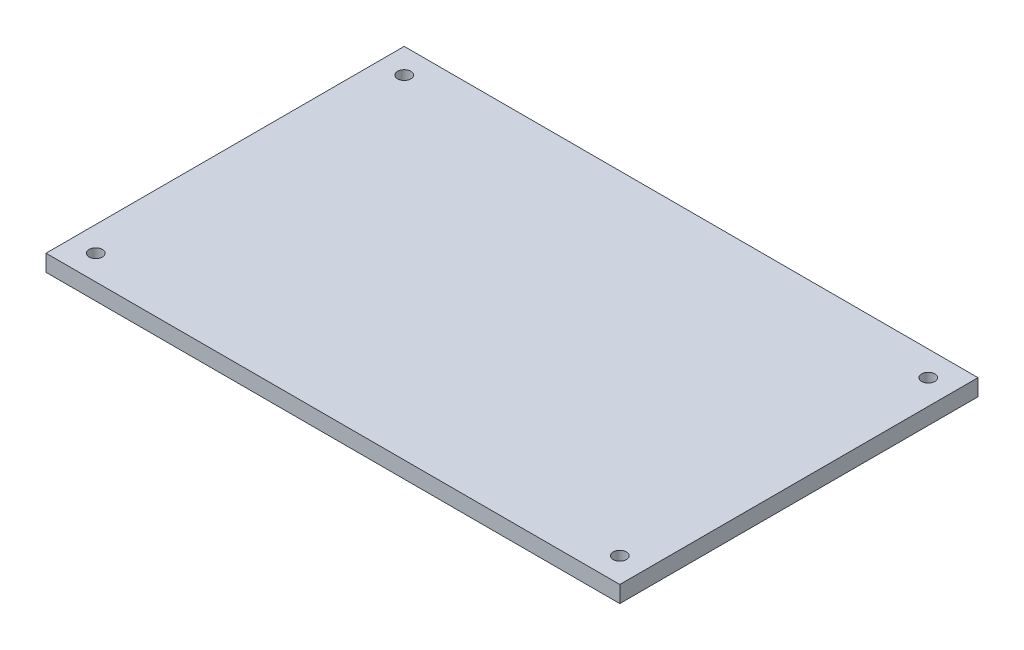
ISO-10303-21;
HEADER;
FILE_DESCRIPTION(('STEP AP214'),'2;1');
FILE_NAME('part.step','',(''),(''),'','','');
FILE_SCHEMA(('AUTOMOTIVE_DESIGN { 1 0 10303 214 1 1 1 1 }'));
ENDSEC;
DATA;
#1=APPLICATION_CONTEXT('core data for automotive mechanical design processes');
#2=APPLICATION_PROTOCOL_DEFINITION('international standard','automotive_design',2000,#1);
#3=PRODUCT_CONTEXT('',#1,'mechanical');
#4=PRODUCT('Part','Part','',(#3));
#5=PRODUCT_RELATED_PRODUCT_CATEGORY('part','',(#4));
#6=PRODUCT_DEFINITION_FORMATION('','',#4);
#7=PRODUCT_DEFINITION_CONTEXT('part definition',#1,'design');
#8=PRODUCT_DEFINITION('design','',#6,#7);
#9=PRODUCT_DEFINITION_SHAPE('','',#8);
#10=(LENGTH_UNIT() NAMED_UNIT(*) SI_UNIT(.MILLI.,.METRE.));
#11=(NAMED_UNIT(*) PLANE_ANGLE_UNIT() SI_UNIT($,.RADIAN.));
#12=(NAMED_UNIT(*) SI_UNIT($,.STERADIAN.) SOLID_ANGLE_UNIT());
#13=UNCERTAINTY_MEASURE_WITH_UNIT(LENGTH_MEASURE(1.E-05),#10,'distance_accuracy_value','');
#14=(GEOMETRIC_REPRESENTATION_CONTEXT(3) GLOBAL_UNCERTAINTY_ASSIGNED_CONTEXT((#13)) GLOBAL_UNIT_ASSIGNED_CONTEXT((#10,
#11,#12)) REPRESENTATION_CONTEXT('',''));
#15=CARTESIAN_POINT('',(0.,0.,0.));
#16=DIRECTION('',(0.,0.,1.));
#17=DIRECTION('',(1.,0.,0.));
#18=AXIS2_PLACEMENT_3D('',#15,#16,#17);
#19=CARTESIAN_POINT('',(0.,0.,0.));
#20=DIRECTION('',(0.,-1.,0.));
#21=DIRECTION('',(0.,0.,-1.));
#22=AXIS2_PLACEMENT_3D('',#19,#20,#21);
#23=PLANE('',#22);
#24=CARTESIAN_POINT('',(79.,0.,46.5));
#25=DIRECTION('',(0.,1.,0.));
#26=DIRECTION('',(0.,0.,1.));
#27=AXIS2_PLACEMENT_3D('',#24,#25,#26);
#28=CIRCLE('',#27,2.);
#29=CARTESIAN_POINT('',(79.,0.,48.5));
#30=VERTEX_POINT('',#29);
#31=EDGE_CURVE('E311',#30,#30,#28,.T.);
#32=ORIENTED_EDGE('',*,*,#31,.T.);
#33=EDGE_LOOP('',(#32));
#34=FACE_BOUND('',#33,.T.);
#35=CARTESIAN_POINT('',(-79.,0.,-46.5));
#36=DIRECTION('',(0.,1.,0.));
#37=DIRECTION('',(0.,0.,1.));
#38=AXIS2_PLACEMENT_3D('',#35,#36,#37);
#39=CIRCLE('',#38,2.);
#40=CARTESIAN_POINT('',(-79.,0.,-44.5));
#41=VERTEX_POINT('',#40);
#42=EDGE_CURVE('E327',#41,#41,#39,.T.);
#43=ORIENTED_EDGE('',*,*,#42,.T.);
#44=EDGE_LOOP('',(#43));
#45=FACE_BOUND('',#44,.T.);
#46=CARTESIAN_POINT('',(79.,0.,-46.5));
#47=DIRECTION('',(0.,1.,0.));
#48=DIRECTION('',(0.,0.,-1.));
#49=AXIS2_PLACEMENT_3D('',#46,#47,#48);
#50=CIRCLE('',#49,2.);
#51=CARTESIAN_POINT('',(79.,0.,-48.5));
#52=VERTEX_POINT('',#51);
#53=EDGE_CURVE('E319',#52,#52,#50,.T.);
#54=ORIENTED_EDGE('',*,*,#53,.T.);
#55=EDGE_LOOP('',(#54));
#56=FACE_BOUND('',#55,.T.);
#57=CARTESIAN_POINT('',(-79.,0.,46.5));
#58=DIRECTION('',(0.,1.,0.));
#59=DIRECTION('',(0.,0.,-1.));
#60=AXIS2_PLACEMENT_3D('',#57,#58,#59);
#61=CIRCLE('',#60,2.);
#62=CARTESIAN_POINT('',(-79.,0.,44.5));
#63=VERTEX_POINT('',#62);
#64=EDGE_CURVE('E292',#63,#63,#61,.T.);
#65=ORIENTED_EDGE('',*,*,#64,.T.);
#66=EDGE_LOOP('',(#65));
#67=FACE_BOUND('',#66,.T.);
#68=DIRECTION('',(-1.,0.,0.));
#69=VECTOR('',#68,1.);
#70=CARTESIAN_POINT('',(43.5,0.,-17.5));
#71=LINE('',#70,#69);
#72=CARTESIAN_POINT('',(43.5,0.,-17.5));
#73=VERTEX_POINT('',#72);
#74=CARTESIAN_POINT('',(21.5,0.,-17.5));
#75=VERTEX_POINT('',#74);
#76=EDGE_CURVE('E232',#73,#75,#71,.T.);
#77=ORIENTED_EDGE('',*,*,#76,.F.);
#78=DIRECTION('',(0.,0.,-1.));
#79=VECTOR('',#78,1.);
#80=CARTESIAN_POINT('',(43.5,0.,-54.));
#81=LINE('',#80,#79);
#82=CARTESIAN_POINT('',(43.5,0.,-54.));
#83=VERTEX_POINT('',#82);
#84=EDGE_CURVE('E61',#73,#83,#81,.T.);
#85=ORIENTED_EDGE('',*,*,#84,.T.);
#86=DIRECTION('',(-1.,0.,0.));
#87=VECTOR('',#86,1.);
#88=CARTESIAN_POINT('',(-86.5,0.,-54.));
#89=LINE('',#88,#87);
#90=CARTESIAN_POINT('',(86.5,0.,-54.));
#91=VERTEX_POINT('',#90);
#92=EDGE_CURVE('E358',#91,#83,#89,.T.);
#93=ORIENTED_EDGE('',*,*,#92,.F.);
#94=DIRECTION('',(0.,0.,-1.));
#95=VECTOR('',#94,1.);
#96=CARTESIAN_POINT('',(86.5,0.,54.));
#97=LINE('',#96,#95);
#98=CARTESIAN_POINT('',(86.5,0.,54.));
#99=VERTEX_POINT('',#98);
#100=EDGE_CURVE('E335',#99,#91,#97,.T.);
#101=ORIENTED_EDGE('',*,*,#100,.F.);
#102=DIRECTION('',(1.,0.,0.));
#103=VECTOR('',#102,1.);
#104=CARTESIAN_POINT('',(-86.5,0.,54.));
#105=LINE('',#104,#103);
#106=CARTESIAN_POINT('',(-86.5,0.,54.));
#107=VERTEX_POINT('',#106);
#108=EDGE_CURVE('E344',#107,#99,#105,.T.);
#109=ORIENTED_EDGE('',*,*,#108,.F.);
#110=DIRECTION('',(0.,0.,1.));
#111=VECTOR('',#110,1.);
#112=CARTESIAN_POINT('',(-86.5,0.,54.));
#113=LINE('',#112,#111);
#114=CARTESIAN_POINT('',(-86.5,0.,-54.));
#115=VERTEX_POINT('',#114);
#116=EDGE_CURVE('E362',#115,#107,#113,.T.);
#117=ORIENTED_EDGE('',*,*,#116,.F.);
#118=CARTESIAN_POINT('',(-43.5,0.,-54.));
#119=VERTEX_POINT('',#118);
#120=EDGE_CURVE('E357',#119,#115,#89,.T.);
#121=ORIENTED_EDGE('',*,*,#120,.F.);
#122=DIRECTION('',(0.,0.,-1.));
#123=VECTOR('',#122,1.);
#124=CARTESIAN_POINT('',(-43.5,0.,-24.));
#125=LINE('',#124,#123);
#126=CARTESIAN_POINT('',(-43.5,0.,-17.5));
#127=VERTEX_POINT('',#126);
#128=EDGE_CURVE('E438',#119,#127,#125,.F.);
#129=ORIENTED_EDGE('',*,*,#128,.T.);
#130=DIRECTION('',(-1.,0.,0.));
#131=VECTOR('',#130,1.);
#132=CARTESIAN_POINT('',(-21.5,0.,-17.5));
#133=LINE('',#132,#131);
#134=CARTESIAN_POINT('',(-21.5,0.,-17.5));
#135=VERTEX_POINT('',#134);
#136=EDGE_CURVE('E249',#135,#127,#133,.T.);
#137=ORIENTED_EDGE('',*,*,#136,.F.);
#138=DIRECTION('',(0.,0.,-1.));
#139=VECTOR('',#138,1.);
#140=CARTESIAN_POINT('',(-21.5,0.,-54.));
#141=LINE('',#140,#139);
#142=CARTESIAN_POINT('',(-21.5,0.,-54.));
#143=VERTEX_POINT('',#142);
#144=EDGE_CURVE('E434',#135,#143,#141,.T.);
#145=ORIENTED_EDGE('',*,*,#144,.T.);
#146=CARTESIAN_POINT('',(21.5,0.,-54.));
#147=VERTEX_POINT('',#146);
#148=EDGE_CURVE('E363',#147,#143,#89,.T.);
#149=ORIENTED_EDGE('',*,*,#148,.F.);
#150=DIRECTION('',(0.,0.,-1.));
#151=VECTOR('',#150,1.);
#152=CARTESIAN_POINT('',(21.5,0.,-24.));
#153=LINE('',#152,#151);
#154=EDGE_CURVE('E68',#147,#75,#153,.F.);
#155=ORIENTED_EDGE('',*,*,#154,.T.);
#156=EDGE_LOOP('',(#77,#85,#93,#101,#109,#117,#121,#129,#137,#145,#149,#155));
#157=FACE_BOUND('',#156,.T.);
#158=ADVANCED_FACE('F45',(#34,#45,#56,#67,#157),#23,.T.);
#159=CARTESIAN_POINT('',(0.,5.,0.));
#160=DIRECTION('',(0.,-1.,0.));
#161=DIRECTION('',(0.,0.,-1.));
#162=AXIS2_PLACEMENT_3D('',#159,#160,#161);
#163=PLANE('',#162);
#164=DIRECTION('',(0.,0.,-1.));
#165=VECTOR('',#164,1.);
#166=CARTESIAN_POINT('',(86.5,5.,54.));
#167=LINE('',#166,#165);
#168=CARTESIAN_POINT('',(86.5,5.,54.));
#169=VERTEX_POINT('',#168);
#170=CARTESIAN_POINT('',(86.5,5.,-54.));
#171=VERTEX_POINT('',#170);
#172=EDGE_CURVE('E339',#169,#171,#167,.T.);
#173=ORIENTED_EDGE('',*,*,#172,.T.);
#174=DIRECTION('',(-1.,0.,0.));
#175=VECTOR('',#174,1.);
#176=CARTESIAN_POINT('',(-86.5,5.,-54.));
#177=LINE('',#176,#175);
#178=CARTESIAN_POINT('',(-86.5,5.,-54.));
#179=VERTEX_POINT('',#178);
#180=EDGE_CURVE('E343',#171,#179,#177,.T.);
#181=ORIENTED_EDGE('',*,*,#180,.T.);
#182=DIRECTION('',(0.,0.,1.));
#183=VECTOR('',#182,1.);
#184=CARTESIAN_POINT('',(-86.5,5.,54.));
#185=LINE('',#184,#183);
#186=CARTESIAN_POINT('',(-86.5,5.,54.));
#187=VERTEX_POINT('',#186);
#188=EDGE_CURVE('E347',#179,#187,#185,.T.);
#189=ORIENTED_EDGE('',*,*,#188,.T.);
#190=DIRECTION('',(1.,0.,0.));
#191=VECTOR('',#190,1.);
#192=CARTESIAN_POINT('',(-86.5,5.,54.));
#193=LINE('',#192,#191);
#194=EDGE_CURVE('E350',#187,#169,#193,.T.);
#195=ORIENTED_EDGE('',*,*,#194,.T.);
#196=EDGE_LOOP('',(#173,#181,#189,#195));
#197=FACE_BOUND('',#196,.T.);
#198=CARTESIAN_POINT('',(-79.,5.,-46.5));
#199=DIRECTION('',(0.,1.,0.));
#200=DIRECTION('',(0.,0.,1.));
#201=AXIS2_PLACEMENT_3D('',#198,#199,#200);
#202=CIRCLE('',#201,2.);
#203=CARTESIAN_POINT('',(-79.,5.,-44.5));
#204=VERTEX_POINT('',#203);
#205=EDGE_CURVE('E331',#204,#204,#202,.T.);
#206=ORIENTED_EDGE('',*,*,#205,.F.);
#207=EDGE_LOOP('',(#206));
#208=FACE_BOUND('',#207,.T.);
#209=CARTESIAN_POINT('',(79.,5.,-46.5));
#210=DIRECTION('',(0.,1.,0.));
#211=DIRECTION('',(0.,0.,-1.));
#212=AXIS2_PLACEMENT_3D('',#209,#210,#211);
#213=CIRCLE('',#212,2.);
#214=CARTESIAN_POINT('',(79.,5.,-48.5));
#215=VERTEX_POINT('',#214);
#216=EDGE_CURVE('E323',#215,#215,#213,.T.);
#217=ORIENTED_EDGE('',*,*,#216,.F.);
#218=EDGE_LOOP('',(#217));
#219=FACE_BOUND('',#218,.T.);
#220=CARTESIAN_POINT('',(79.,5.,46.5));
#221=DIRECTION('',(0.,1.,0.));
#222=DIRECTION('',(0.,0.,1.));
#223=AXIS2_PLACEMENT_3D('',#220,#221,#222);
#224=CIRCLE('',#223,2.);
#225=CARTESIAN_POINT('',(79.,5.,48.5));
#226=VERTEX_POINT('',#225);
#227=EDGE_CURVE('E315',#226,#226,#224,.T.);
#228=ORIENTED_EDGE('',*,*,#227,.F.);
#229=EDGE_LOOP('',(#228));
#230=FACE_BOUND('',#229,.T.);
#231=CARTESIAN_POINT('',(-79.,5.,46.5));
#232=DIRECTION('',(0.,1.,0.));
#233=DIRECTION('',(0.,0.,-1.));
#234=AXIS2_PLACEMENT_3D('',#231,#232,#233);
#235=CIRCLE('',#234,2.);
#236=CARTESIAN_POINT('',(-79.,5.,44.5));
#237=VERTEX_POINT('',#236);
#238=EDGE_CURVE('E307',#237,#237,#235,.T.);
#239=ORIENTED_EDGE('',*,*,#238,.F.);
#240=EDGE_LOOP('',(#239));
#241=FACE_BOUND('',#240,.T.);
#242=ADVANCED_FACE('F486',(#197,#208,#219,#230,#241),#163,.F.);
#243=CARTESIAN_POINT('',(86.5,5.,54.));
#244=DIRECTION('',(-1.,0.,0.));
#245=DIRECTION('',(0.,0.,1.));
#246=AXIS2_PLACEMENT_3D('',#243,#244,#245);
#247=PLANE('',#246);
#248=ORIENTED_EDGE('',*,*,#100,.T.);
#249=DIRECTION('',(0.,-1.,0.));
#250=VECTOR('',#249,1.);
#251=CARTESIAN_POINT('',(86.5,5.,-54.));
#252=LINE('',#251,#250);
#253=EDGE_CURVE('E379',#171,#91,#252,.T.);
#254=ORIENTED_EDGE('',*,*,#253,.F.);
#255=ORIENTED_EDGE('',*,*,#172,.F.);
#256=DIRECTION('',(0.,-1.,0.));
#257=VECTOR('',#256,1.);
#258=CARTESIAN_POINT('',(86.5,5.,54.));
#259=LINE('',#258,#257);
#260=EDGE_CURVE('E353',#169,#99,#259,.T.);
#261=ORIENTED_EDGE('',*,*,#260,.T.);
#262=EDGE_LOOP('',(#248,#254,#255,#261));
#263=FACE_BOUND('',#262,.T.);
#264=ADVANCED_FACE('F483',(#263),#247,.F.);
#265=CARTESIAN_POINT('',(-86.5,5.,-54.));
#266=DIRECTION('',(0.,0.,1.));
#267=DIRECTION('',(1.,0.,0.));
#268=AXIS2_PLACEMENT_3D('',#265,#266,#267);
#269=PLANE('',#268);
#270=DIRECTION('',(0.,-1.,0.));
#271=VECTOR('',#270,1.);
#272=CARTESIAN_POINT('',(42.5,0.,-54.));
#273=LINE('',#272,#271);
#274=CARTESIAN_POINT('',(42.5,-1.,-54.));
#275=VERTEX_POINT('',#274);
#276=CARTESIAN_POINT('',(42.5,-9.2,-54.));
#277=VERTEX_POINT('',#276);
#278=EDGE_CURVE('E280',#275,#277,#273,.T.);
#279=ORIENTED_EDGE('',*,*,#278,.T.);
#280=CARTESIAN_POINT('',(41.5,-9.2,-54.));
#281=DIRECTION('',(0.,0.,1.));
#282=DIRECTION('',(1.,0.,0.));
#283=AXIS2_PLACEMENT_3D('',#280,#281,#282);
#284=CIRCLE('',#283,1.);
#285=CARTESIAN_POINT('',(41.5,-10.2,-54.));
#286=VERTEX_POINT('',#285);
#287=EDGE_CURVE('E196',#277,#286,#284,.F.);
#288=ORIENTED_EDGE('',*,*,#287,.T.);
#289=DIRECTION('',(-1.,0.,0.));
#290=VECTOR('',#289,1.);
#291=CARTESIAN_POINT('',(42.5,-10.2,-54.));
#292=LINE('',#291,#290);
#293=CARTESIAN_POINT('',(23.5,-10.2,-54.));
#294=VERTEX_POINT('',#293);
#295=EDGE_CURVE('E285',#286,#294,#292,.T.);
#296=ORIENTED_EDGE('',*,*,#295,.T.);
#297=CARTESIAN_POINT('',(23.5,-9.2,-54.));
#298=DIRECTION('',(0.,0.,1.));
#299=DIRECTION('',(1.,0.,0.));
#300=AXIS2_PLACEMENT_3D('',#297,#298,#299);
#301=CIRCLE('',#300,1.);
#302=CARTESIAN_POINT('',(22.5,-9.2,-54.));
#303=VERTEX_POINT('',#302);
#304=EDGE_CURVE('E190',#294,#303,#301,.F.);
#305=ORIENTED_EDGE('',*,*,#304,.T.);
#306=DIRECTION('',(0.,1.,0.));
#307=VECTOR('',#306,1.);
#308=CARTESIAN_POINT('',(22.5,0.,-54.));
#309=LINE('',#308,#307);
#310=CARTESIAN_POINT('',(22.5,-1.,-54.));
#311=VERTEX_POINT('',#310);
#312=EDGE_CURVE('E288',#303,#311,#309,.T.);
#313=ORIENTED_EDGE('',*,*,#312,.T.);
#314=CARTESIAN_POINT('',(21.5,-1.,-54.));
#315=DIRECTION('',(0.,0.,1.));
#316=DIRECTION('',(1.,0.,0.));
#317=AXIS2_PLACEMENT_3D('',#314,#315,#316);
#318=CIRCLE('',#317,1.);
#319=EDGE_CURVE('E11',#311,#147,#318,.T.);
#320=ORIENTED_EDGE('',*,*,#319,.T.);
#321=ORIENTED_EDGE('',*,*,#148,.T.);
#322=CARTESIAN_POINT('',(-21.5,-1.,-54.));
#323=DIRECTION('',(0.,0.,1.));
#324=DIRECTION('',(1.,0.,0.));
#325=AXIS2_PLACEMENT_3D('',#322,#323,#324);
#326=CIRCLE('',#325,1.);
#327=CARTESIAN_POINT('',(-22.5,-1.,-54.));
#328=VERTEX_POINT('',#327);
#329=EDGE_CURVE('E444',#143,#328,#326,.T.);
#330=ORIENTED_EDGE('',*,*,#329,.T.);
#331=DIRECTION('',(0.,-1.,0.));
#332=VECTOR('',#331,1.);
#333=CARTESIAN_POINT('',(-22.5,0.,-54.));
#334=LINE('',#333,#332);
#335=CARTESIAN_POINT('',(-22.5,-9.2,-54.));
#336=VERTEX_POINT('',#335);
#337=EDGE_CURVE('E300',#328,#336,#334,.T.);
#338=ORIENTED_EDGE('',*,*,#337,.T.);
#339=CARTESIAN_POINT('',(-23.5,-9.2,-54.));
#340=DIRECTION('',(0.,0.,1.));
#341=DIRECTION('',(1.,0.,0.));
#342=AXIS2_PLACEMENT_3D('',#339,#340,#341);
#343=CIRCLE('',#342,1.);
#344=CARTESIAN_POINT('',(-23.5,-10.2,-54.));
#345=VERTEX_POINT('',#344);
#346=EDGE_CURVE('E393',#336,#345,#343,.F.);
#347=ORIENTED_EDGE('',*,*,#346,.T.);
#348=DIRECTION('',(-1.,0.,0.));
#349=VECTOR('',#348,1.);
#350=CARTESIAN_POINT('',(-22.5,-10.2,-54.));
#351=LINE('',#350,#349);
#352=CARTESIAN_POINT('',(-41.5,-10.2,-54.));
#353=VERTEX_POINT('',#352);
#354=EDGE_CURVE('E296',#345,#353,#351,.T.);
#355=ORIENTED_EDGE('',*,*,#354,.T.);
#356=CARTESIAN_POINT('',(-41.5,-9.2,-54.));
#357=DIRECTION('',(0.,0.,1.));
#358=DIRECTION('',(1.,0.,0.));
#359=AXIS2_PLACEMENT_3D('',#356,#357,#358);
#360=CIRCLE('',#359,1.);
#361=CARTESIAN_POINT('',(-42.5,-9.2,-54.));
#362=VERTEX_POINT('',#361);
#363=EDGE_CURVE('E390',#353,#362,#360,.F.);
#364=ORIENTED_EDGE('',*,*,#363,.T.);
#365=DIRECTION('',(0.,1.,0.));
#366=VECTOR('',#365,1.);
#367=CARTESIAN_POINT('',(-42.5,0.,-54.));
#368=LINE('',#367,#366);
#369=CARTESIAN_POINT('',(-42.5,-1.,-54.));
#370=VERTEX_POINT('',#369);
#371=EDGE_CURVE('E240',#362,#370,#368,.T.);
#372=ORIENTED_EDGE('',*,*,#371,.T.);
#373=CARTESIAN_POINT('',(-43.5,-1.,-54.));
#374=DIRECTION('',(0.,0.,1.));
#375=DIRECTION('',(1.,0.,0.));
#376=AXIS2_PLACEMENT_3D('',#373,#374,#375);
#377=CIRCLE('',#376,1.);
#378=EDGE_CURVE('E441',#370,#119,#377,.T.);
#379=ORIENTED_EDGE('',*,*,#378,.T.);
#380=ORIENTED_EDGE('',*,*,#120,.T.);
#381=DIRECTION('',(0.,-1.,0.));
#382=VECTOR('',#381,1.);
#383=CARTESIAN_POINT('',(-86.5,5.,-54.));
#384=LINE('',#383,#382);
#385=EDGE_CURVE('E375',#179,#115,#384,.T.);
#386=ORIENTED_EDGE('',*,*,#385,.F.);
#387=ORIENTED_EDGE('',*,*,#180,.F.);
#388=ORIENTED_EDGE('',*,*,#253,.T.);
#389=ORIENTED_EDGE('',*,*,#92,.T.);
#390=CARTESIAN_POINT('',(43.5,-1.,-54.));
#391=DIRECTION('',(0.,0.,1.));
#392=DIRECTION('',(1.,0.,0.));
#393=AXIS2_PLACEMENT_3D('',#390,#391,#392);
#394=CIRCLE('',#393,1.);
#395=EDGE_CURVE('E54',#83,#275,#394,.T.);
#396=ORIENTED_EDGE('',*,*,#395,.T.);
#397=EDGE_LOOP('',(#279,#288,#296,#305,#313,#320,#321,#330,#338,#347,#355,#364,#372,#379,#380,
#386,#387,#388,#389,#396));
#398=FACE_BOUND('',#397,.T.);
#399=CARTESIAN_POINT('',(-32.5,-5.2,-54.));
#400=DIRECTION('',(0.,0.,-1.));
#401=DIRECTION('',(-1.,0.,0.));
#402=AXIS2_PLACEMENT_3D('',#399,#400,#401);
#403=CIRCLE('',#402,1.75);
#404=CARTESIAN_POINT('',(-34.25,-5.2,-54.));
#405=VERTEX_POINT('',#404);
#406=EDGE_CURVE('E281',#405,#405,#403,.T.);
#407=ORIENTED_EDGE('',*,*,#406,.F.);
#408=EDGE_LOOP('',(#407));
#409=FACE_BOUND('',#408,.T.);
#410=CARTESIAN_POINT('',(32.5,-5.2,-54.));
#411=DIRECTION('',(0.,0.,-1.));
#412=DIRECTION('',(-1.,0.,0.));
#413=AXIS2_PLACEMENT_3D('',#410,#411,#412);
#414=CIRCLE('',#413,1.75);
#415=CARTESIAN_POINT('',(30.75,-5.2,-54.));
#416=VERTEX_POINT('',#415);
#417=EDGE_CURVE('E276',#416,#416,#414,.T.);
#418=ORIENTED_EDGE('',*,*,#417,.F.);
#419=EDGE_LOOP('',(#418));
#420=FACE_BOUND('',#419,.T.);
#421=ADVANCED_FACE('F449',(#398,#409,#420),#269,.F.);
#422=CARTESIAN_POINT('',(-86.5,5.,54.));
#423=DIRECTION('',(1.,0.,0.));
#424=DIRECTION('',(0.,0.,-1.));
#425=AXIS2_PLACEMENT_3D('',#422,#423,#424);
#426=PLANE('',#425);
#427=ORIENTED_EDGE('',*,*,#116,.T.);
#428=DIRECTION('',(0.,-1.,0.));
#429=VECTOR('',#428,1.);
#430=CARTESIAN_POINT('',(-86.5,5.,54.));
#431=LINE('',#430,#429);
#432=EDGE_CURVE('E371',#187,#107,#431,.T.);
#433=ORIENTED_EDGE('',*,*,#432,.F.);
#434=ORIENTED_EDGE('',*,*,#188,.F.);
#435=ORIENTED_EDGE('',*,*,#385,.T.);
#436=EDGE_LOOP('',(#427,#433,#434,#435));
#437=FACE_BOUND('',#436,.T.);
#438=ADVANCED_FACE('F473',(#437),#426,.F.);
#439=CARTESIAN_POINT('',(-86.5,5.,54.));
#440=DIRECTION('',(0.,0.,-1.));
#441=DIRECTION('',(-1.,0.,0.));
#442=AXIS2_PLACEMENT_3D('',#439,#440,#441);
#443=PLANE('',#442);
#444=ORIENTED_EDGE('',*,*,#108,.T.);
#445=ORIENTED_EDGE('',*,*,#260,.F.);
#446=ORIENTED_EDGE('',*,*,#194,.F.);
#447=ORIENTED_EDGE('',*,*,#432,.T.);
#448=EDGE_LOOP('',(#444,#445,#446,#447));
#449=FACE_BOUND('',#448,.T.);
#450=ADVANCED_FACE('F479',(#449),#443,.F.);
#451=CARTESIAN_POINT('',(-79.,5.,-46.5));
#452=DIRECTION('',(0.,-1.,0.));
#453=DIRECTION('',(0.,0.,-1.));
#454=AXIS2_PLACEMENT_3D('',#451,#452,#453);
#455=CYLINDRICAL_SURFACE('',#454,2.);
#456=ORIENTED_EDGE('',*,*,#205,.T.);
#457=EDGE_LOOP('',(#456));
#458=FACE_BOUND('',#457,.T.);
#459=ORIENTED_EDGE('',*,*,#42,.F.);
#460=EDGE_LOOP('',(#459));
#461=FACE_BOUND('',#460,.T.);
#462=ADVANCED_FACE('F518',(#458,#461),#455,.F.);
#463=CARTESIAN_POINT('',(79.,5.,-46.5));
#464=DIRECTION('',(0.,-1.,0.));
#465=DIRECTION('',(0.,0.,-1.));
#466=AXIS2_PLACEMENT_3D('',#463,#464,#465);
#467=CYLINDRICAL_SURFACE('',#466,2.);
#468=ORIENTED_EDGE('',*,*,#216,.T.);
#469=EDGE_LOOP('',(#468));
#470=FACE_BOUND('',#469,.T.);
#471=ORIENTED_EDGE('',*,*,#53,.F.);
#472=EDGE_LOOP('',(#471));
#473=FACE_BOUND('',#472,.T.);
#474=ADVANCED_FACE('F584',(#470,#473),#467,.F.);
#475=CARTESIAN_POINT('',(79.,5.,46.5));
#476=DIRECTION('',(0.,-1.,0.));
#477=DIRECTION('',(0.,0.,-1.));
#478=AXIS2_PLACEMENT_3D('',#475,#476,#477);
#479=CYLINDRICAL_SURFACE('',#478,2.);
#480=ORIENTED_EDGE('',*,*,#227,.T.);
#481=EDGE_LOOP('',(#480));
#482=FACE_BOUND('',#481,.T.);
#483=ORIENTED_EDGE('',*,*,#31,.F.);
#484=EDGE_LOOP('',(#483));
#485=FACE_BOUND('',#484,.T.);
#486=ADVANCED_FACE('F502',(#482,#485),#479,.F.);
#487=CARTESIAN_POINT('',(-79.,5.,46.5));
#488=DIRECTION('',(0.,-1.,0.));
#489=DIRECTION('',(0.,0.,-1.));
#490=AXIS2_PLACEMENT_3D('',#487,#488,#489);
#491=CYLINDRICAL_SURFACE('',#490,2.);
#492=ORIENTED_EDGE('',*,*,#238,.T.);
#493=EDGE_LOOP('',(#492));
#494=FACE_BOUND('',#493,.T.);
#495=ORIENTED_EDGE('',*,*,#64,.F.);
#496=EDGE_LOOP('',(#495));
#497=FACE_BOUND('',#496,.T.);
#498=ADVANCED_FACE('F498',(#494,#497),#491,.F.);
#499=CARTESIAN_POINT('',(-22.5,0.,-24.));
#500=DIRECTION('',(1.,0.,0.));
#501=DIRECTION('',(0.,0.,-1.));
#502=AXIS2_PLACEMENT_3D('',#499,#500,#501);
#503=PLANE('',#502);
#504=DIRECTION('',(0.,0.,-1.));
#505=VECTOR('',#504,1.);
#506=CARTESIAN_POINT('',(-22.5,-1.,-24.));
#507=LINE('',#506,#505);
#508=CARTESIAN_POINT('',(-22.5,-1.,-17.5));
#509=VERTEX_POINT('',#508);
#510=EDGE_CURVE('E409',#328,#509,#507,.F.);
#511=ORIENTED_EDGE('',*,*,#510,.T.);
#512=DIRECTION('',(0.,1.,0.));
#513=VECTOR('',#512,1.);
#514=CARTESIAN_POINT('',(-22.5,-9.2,-17.5));
#515=LINE('',#514,#513);
#516=CARTESIAN_POINT('',(-22.5,-9.2,-17.5));
#517=VERTEX_POINT('',#516);
#518=EDGE_CURVE('E257',#517,#509,#515,.T.);
#519=ORIENTED_EDGE('',*,*,#518,.F.);
#520=DIRECTION('',(0.,0.,-1.));
#521=VECTOR('',#520,1.);
#522=CARTESIAN_POINT('',(-22.5,-9.2,-24.));
#523=LINE('',#522,#521);
#524=EDGE_CURVE('E412',#517,#336,#523,.T.);
#525=ORIENTED_EDGE('',*,*,#524,.T.);
#526=ORIENTED_EDGE('',*,*,#337,.F.);
#527=EDGE_LOOP('',(#511,#519,#525,#526));
#528=FACE_BOUND('',#527,.T.);
#529=ADVANCED_FACE('F501',(#528),#503,.T.);
#530=CARTESIAN_POINT('',(-42.5,0.,-24.));
#531=DIRECTION('',(-1.,0.,0.));
#532=DIRECTION('',(0.,0.,1.));
#533=AXIS2_PLACEMENT_3D('',#530,#531,#532);
#534=PLANE('',#533);
#535=ORIENTED_EDGE('',*,*,#371,.F.);
#536=DIRECTION('',(0.,0.,-1.));
#537=VECTOR('',#536,1.);
#538=CARTESIAN_POINT('',(-42.5,-9.2,-24.));
#539=LINE('',#538,#537);
#540=CARTESIAN_POINT('',(-42.5,-9.2,-17.5));
#541=VERTEX_POINT('',#540);
#542=EDGE_CURVE('E427',#362,#541,#539,.F.);
#543=ORIENTED_EDGE('',*,*,#542,.T.);
#544=DIRECTION('',(0.,-1.,0.));
#545=VECTOR('',#544,1.);
#546=CARTESIAN_POINT('',(-42.5,-1.,-17.5));
#547=LINE('',#546,#545);
#548=CARTESIAN_POINT('',(-42.5,-1.,-17.5));
#549=VERTEX_POINT('',#548);
#550=EDGE_CURVE('E241',#549,#541,#547,.T.);
#551=ORIENTED_EDGE('',*,*,#550,.F.);
#552=DIRECTION('',(0.,0.,-1.));
#553=VECTOR('',#552,1.);
#554=CARTESIAN_POINT('',(-42.5,-1.,-54.));
#555=LINE('',#554,#553);
#556=EDGE_CURVE('E423',#549,#370,#555,.T.);
#557=ORIENTED_EDGE('',*,*,#556,.T.);
#558=EDGE_LOOP('',(#535,#543,#551,#557));
#559=FACE_BOUND('',#558,.T.);
#560=ADVANCED_FACE('F570',(#559),#534,.T.);
#561=CARTESIAN_POINT('',(-22.5,-10.2,-24.));
#562=DIRECTION('',(0.,-1.,0.));
#563=DIRECTION('',(0.,0.,-1.));
#564=AXIS2_PLACEMENT_3D('',#561,#562,#563);
#565=PLANE('',#564);
#566=ORIENTED_EDGE('',*,*,#354,.F.);
#567=DIRECTION('',(0.,0.,-1.));
#568=VECTOR('',#567,1.);
#569=CARTESIAN_POINT('',(-23.5,-10.2,-24.));
#570=LINE('',#569,#568);
#571=CARTESIAN_POINT('',(-23.5,-10.2,-17.5));
#572=VERTEX_POINT('',#571);
#573=EDGE_CURVE('E420',#345,#572,#570,.F.);
#574=ORIENTED_EDGE('',*,*,#573,.T.);
#575=DIRECTION('',(1.,0.,0.));
#576=VECTOR('',#575,1.);
#577=CARTESIAN_POINT('',(-41.5,-10.2,-17.5));
#578=LINE('',#577,#576);
#579=CARTESIAN_POINT('',(-41.5,-10.2,-17.5));
#580=VERTEX_POINT('',#579);
#581=EDGE_CURVE('E265',#580,#572,#578,.T.);
#582=ORIENTED_EDGE('',*,*,#581,.F.);
#583=DIRECTION('',(0.,0.,-1.));
#584=VECTOR('',#583,1.);
#585=CARTESIAN_POINT('',(-41.5,-10.2,-24.));
#586=LINE('',#585,#584);
#587=EDGE_CURVE('E416',#580,#353,#586,.T.);
#588=ORIENTED_EDGE('',*,*,#587,.T.);
#589=EDGE_LOOP('',(#566,#574,#582,#588));
#590=FACE_BOUND('',#589,.T.);
#591=ADVANCED_FACE('F572',(#590),#565,.T.);
#592=CARTESIAN_POINT('',(-32.5,-5.2,-24.));
#593=DIRECTION('',(0.,0.,-1.));
#594=DIRECTION('',(-1.,0.,0.));
#595=AXIS2_PLACEMENT_3D('',#592,#593,#594);
#596=CYLINDRICAL_SURFACE('',#595,1.75);
#597=ORIENTED_EDGE('',*,*,#406,.T.);
#598=EDGE_LOOP('',(#597));
#599=FACE_BOUND('',#598,.T.);
#600=CARTESIAN_POINT('',(-32.5,-5.2,-17.5));
#601=DIRECTION('',(0.,0.,1.));
#602=DIRECTION('',(1.,0.,0.));
#603=AXIS2_PLACEMENT_3D('',#600,#601,#602);
#604=CIRCLE('',#603,1.75);
#605=CARTESIAN_POINT('',(-30.75,-5.2,-17.5));
#606=VERTEX_POINT('',#605);
#607=EDGE_CURVE('E219',#606,#606,#604,.T.);
#608=ORIENTED_EDGE('',*,*,#607,.T.);
#609=EDGE_LOOP('',(#608));
#610=FACE_BOUND('',#609,.T.);
#611=ADVANCED_FACE('F568',(#599,#610),#596,.F.);
#612=CARTESIAN_POINT('',(42.5,0.,-24.));
#613=DIRECTION('',(1.,0.,0.));
#614=DIRECTION('',(0.,0.,-1.));
#615=AXIS2_PLACEMENT_3D('',#612,#613,#614);
#616=PLANE('',#615);
#617=DIRECTION('',(0.,0.,-1.));
#618=VECTOR('',#617,1.);
#619=CARTESIAN_POINT('',(42.5,-1.,-24.));
#620=LINE('',#619,#618);
#621=CARTESIAN_POINT('',(42.5,-1.,-17.5));
#622=VERTEX_POINT('',#621);
#623=EDGE_CURVE('E383',#275,#622,#620,.F.);
#624=ORIENTED_EDGE('',*,*,#623,.T.);
#625=DIRECTION('',(0.,1.,0.));
#626=VECTOR('',#625,1.);
#627=CARTESIAN_POINT('',(42.5,-9.2,-17.5));
#628=LINE('',#627,#626);
#629=CARTESIAN_POINT('',(42.5,-9.2,-17.5));
#630=VERTEX_POINT('',#629);
#631=EDGE_CURVE('E224',#630,#622,#628,.T.);
#632=ORIENTED_EDGE('',*,*,#631,.F.);
#633=DIRECTION('',(0.,0.,-1.));
#634=VECTOR('',#633,1.);
#635=CARTESIAN_POINT('',(42.5,-9.2,-24.));
#636=LINE('',#635,#634);
#637=EDGE_CURVE('E386',#630,#277,#636,.T.);
#638=ORIENTED_EDGE('',*,*,#637,.T.);
#639=ORIENTED_EDGE('',*,*,#278,.F.);
#640=EDGE_LOOP('',(#624,#632,#638,#639));
#641=FACE_BOUND('',#640,.T.);
#642=ADVANCED_FACE('F453',(#641),#616,.T.);
#643=CARTESIAN_POINT('',(22.5,0.,-24.));
#644=DIRECTION('',(-1.,0.,0.));
#645=DIRECTION('',(0.,0.,1.));
#646=AXIS2_PLACEMENT_3D('',#643,#644,#645);
#647=PLANE('',#646);
#648=ORIENTED_EDGE('',*,*,#312,.F.);
#649=DIRECTION('',(0.,0.,-1.));
#650=VECTOR('',#649,1.);
#651=CARTESIAN_POINT('',(22.5,-9.2,-24.));
#652=LINE('',#651,#650);
#653=CARTESIAN_POINT('',(22.5,-9.2,-17.5));
#654=VERTEX_POINT('',#653);
#655=EDGE_CURVE('E406',#303,#654,#652,.F.);
#656=ORIENTED_EDGE('',*,*,#655,.T.);
#657=DIRECTION('',(0.,-1.,0.));
#658=VECTOR('',#657,1.);
#659=CARTESIAN_POINT('',(22.5,-1.,-17.5));
#660=LINE('',#659,#658);
#661=CARTESIAN_POINT('',(22.5,-1.,-17.5));
#662=VERTEX_POINT('',#661);
#663=EDGE_CURVE('E213',#662,#654,#660,.T.);
#664=ORIENTED_EDGE('',*,*,#663,.F.);
#665=DIRECTION('',(0.,0.,-1.));
#666=VECTOR('',#665,1.);
#667=CARTESIAN_POINT('',(22.5,-1.,-54.));
#668=LINE('',#667,#666);
#669=EDGE_CURVE('E402',#662,#311,#668,.T.);
#670=ORIENTED_EDGE('',*,*,#669,.T.);
#671=EDGE_LOOP('',(#648,#656,#664,#670));
#672=FACE_BOUND('',#671,.T.);
#673=ADVANCED_FACE('F461',(#672),#647,.T.);
#674=CARTESIAN_POINT('',(42.5,-10.2,-24.));
#675=DIRECTION('',(0.,-1.,0.));
#676=DIRECTION('',(0.,0.,-1.));
#677=AXIS2_PLACEMENT_3D('',#674,#675,#676);
#678=PLANE('',#677);
#679=ORIENTED_EDGE('',*,*,#295,.F.);
#680=DIRECTION('',(0.,0.,-1.));
#681=VECTOR('',#680,1.);
#682=CARTESIAN_POINT('',(41.5,-10.2,-24.));
#683=LINE('',#682,#681);
#684=CARTESIAN_POINT('',(41.5,-10.2,-17.5));
#685=VERTEX_POINT('',#684);
#686=EDGE_CURVE('E195',#286,#685,#683,.F.);
#687=ORIENTED_EDGE('',*,*,#686,.T.);
#688=DIRECTION('',(1.,0.,0.));
#689=VECTOR('',#688,1.);
#690=CARTESIAN_POINT('',(23.5,-10.2,-17.5));
#691=LINE('',#690,#689);
#692=CARTESIAN_POINT('',(23.5,-10.2,-17.5));
#693=VERTEX_POINT('',#692);
#694=EDGE_CURVE('E199',#693,#685,#691,.T.);
#695=ORIENTED_EDGE('',*,*,#694,.F.);
#696=DIRECTION('',(0.,0.,-1.));
#697=VECTOR('',#696,1.);
#698=CARTESIAN_POINT('',(23.5,-10.2,-24.));
#699=LINE('',#698,#697);
#700=EDGE_CURVE('E184',#693,#294,#699,.T.);
#701=ORIENTED_EDGE('',*,*,#700,.T.);
#702=EDGE_LOOP('',(#679,#687,#695,#701));
#703=FACE_BOUND('',#702,.T.);
#704=ADVANCED_FACE('F200',(#703),#678,.T.);
#705=CARTESIAN_POINT('',(32.5,-5.2,-24.));
#706=DIRECTION('',(0.,0.,-1.));
#707=DIRECTION('',(-1.,0.,0.));
#708=AXIS2_PLACEMENT_3D('',#705,#706,#707);
#709=CYLINDRICAL_SURFACE('',#708,1.75);
#710=ORIENTED_EDGE('',*,*,#417,.T.);
#711=EDGE_LOOP('',(#710));
#712=FACE_BOUND('',#711,.T.);
#713=CARTESIAN_POINT('',(32.5,-5.2,-17.5));
#714=DIRECTION('',(0.,0.,1.));
#715=DIRECTION('',(1.,0.,0.));
#716=AXIS2_PLACEMENT_3D('',#713,#714,#715);
#717=CIRCLE('',#716,1.75);
#718=CARTESIAN_POINT('',(34.25,-5.2,-17.5));
#719=VERTEX_POINT('',#718);
#720=EDGE_CURVE('E215',#719,#719,#717,.T.);
#721=ORIENTED_EDGE('',*,*,#720,.T.);
#722=EDGE_LOOP('',(#721));
#723=FACE_BOUND('',#722,.T.);
#724=ADVANCED_FACE('F526',(#712,#723),#709,.F.);
#725=CARTESIAN_POINT('',(41.5,-9.2,-24.));
#726=DIRECTION('',(0.,0.,-1.));
#727=DIRECTION('',(-1.,0.,0.));
#728=AXIS2_PLACEMENT_3D('',#725,#726,#727);
#729=CYLINDRICAL_SURFACE('',#728,1.);
#730=ORIENTED_EDGE('',*,*,#637,.F.);
#731=CARTESIAN_POINT('',(41.5,-9.2,-17.5));
#732=DIRECTION('',(0.,0.,1.));
#733=DIRECTION('',(1.,0.,0.));
#734=AXIS2_PLACEMENT_3D('',#731,#732,#733);
#735=CIRCLE('',#734,1.);
#736=EDGE_CURVE('E206',#685,#630,#735,.T.);
#737=ORIENTED_EDGE('',*,*,#736,.F.);
#738=ORIENTED_EDGE('',*,*,#686,.F.);
#739=ORIENTED_EDGE('',*,*,#287,.F.);
#740=EDGE_LOOP('',(#730,#737,#738,#739));
#741=FACE_BOUND('',#740,.T.);
#742=ADVANCED_FACE('F458',(#741),#729,.T.);
#743=CARTESIAN_POINT('',(23.5,-9.2,-24.));
#744=DIRECTION('',(0.,0.,-1.));
#745=DIRECTION('',(-1.,0.,0.));
#746=AXIS2_PLACEMENT_3D('',#743,#744,#745);
#747=CYLINDRICAL_SURFACE('',#746,1.);
#748=ORIENTED_EDGE('',*,*,#700,.F.);
#749=CARTESIAN_POINT('',(23.5,-9.2,-17.5));
#750=DIRECTION('',(0.,0.,1.));
#751=DIRECTION('',(1.,0.,0.));
#752=AXIS2_PLACEMENT_3D('',#749,#750,#751);
#753=CIRCLE('',#752,1.);
#754=EDGE_CURVE('E189',#654,#693,#753,.T.);
#755=ORIENTED_EDGE('',*,*,#754,.F.);
#756=ORIENTED_EDGE('',*,*,#655,.F.);
#757=ORIENTED_EDGE('',*,*,#304,.F.);
#758=EDGE_LOOP('',(#748,#755,#756,#757));
#759=FACE_BOUND('',#758,.T.);
#760=ADVANCED_FACE('F186',(#759),#747,.T.);
#761=CARTESIAN_POINT('',(-23.5,-9.2,-24.));
#762=DIRECTION('',(0.,0.,-1.));
#763=DIRECTION('',(-1.,0.,0.));
#764=AXIS2_PLACEMENT_3D('',#761,#762,#763);
#765=CYLINDRICAL_SURFACE('',#764,1.);
#766=ORIENTED_EDGE('',*,*,#524,.F.);
#767=CARTESIAN_POINT('',(-23.5,-9.2,-17.5));
#768=DIRECTION('',(0.,0.,1.));
#769=DIRECTION('',(1.,0.,0.));
#770=AXIS2_PLACEMENT_3D('',#767,#768,#769);
#771=CIRCLE('',#770,1.);
#772=EDGE_CURVE('E261',#572,#517,#771,.T.);
#773=ORIENTED_EDGE('',*,*,#772,.F.);
#774=ORIENTED_EDGE('',*,*,#573,.F.);
#775=ORIENTED_EDGE('',*,*,#346,.F.);
#776=EDGE_LOOP('',(#766,#773,#774,#775));
#777=FACE_BOUND('',#776,.T.);
#778=ADVANCED_FACE('F529',(#777),#765,.T.);
#779=CARTESIAN_POINT('',(-41.5,-9.2,-24.));
#780=DIRECTION('',(0.,0.,-1.));
#781=DIRECTION('',(-1.,0.,0.));
#782=AXIS2_PLACEMENT_3D('',#779,#780,#781);
#783=CYLINDRICAL_SURFACE('',#782,1.);
#784=ORIENTED_EDGE('',*,*,#587,.F.);
#785=CARTESIAN_POINT('',(-41.5,-9.2,-17.5));
#786=DIRECTION('',(0.,0.,1.));
#787=DIRECTION('',(1.,0.,0.));
#788=AXIS2_PLACEMENT_3D('',#785,#786,#787);
#789=CIRCLE('',#788,1.);
#790=EDGE_CURVE('E269',#541,#580,#789,.T.);
#791=ORIENTED_EDGE('',*,*,#790,.F.);
#792=ORIENTED_EDGE('',*,*,#542,.F.);
#793=ORIENTED_EDGE('',*,*,#363,.F.);
#794=EDGE_LOOP('',(#784,#791,#792,#793));
#795=FACE_BOUND('',#794,.T.);
#796=ADVANCED_FACE('F532',(#795),#783,.T.);
#797=CARTESIAN_POINT('',(-43.5,-1.,-24.));
#798=DIRECTION('',(0.,0.,1.));
#799=DIRECTION('',(1.,0.,0.));
#800=AXIS2_PLACEMENT_3D('',#797,#798,#799);
#801=CYLINDRICAL_SURFACE('',#800,1.);
#802=ORIENTED_EDGE('',*,*,#556,.F.);
#803=CARTESIAN_POINT('',(-43.5,-1.,-17.5));
#804=DIRECTION('',(0.,0.,-1.));
#805=DIRECTION('',(1.,0.,0.));
#806=AXIS2_PLACEMENT_3D('',#803,#804,#805);
#807=CIRCLE('',#806,1.);
#808=EDGE_CURVE('E245',#127,#549,#807,.T.);
#809=ORIENTED_EDGE('',*,*,#808,.F.);
#810=ORIENTED_EDGE('',*,*,#128,.F.);
#811=ORIENTED_EDGE('',*,*,#378,.F.);
#812=EDGE_LOOP('',(#802,#809,#810,#811));
#813=FACE_BOUND('',#812,.T.);
#814=ADVANCED_FACE('F536',(#813),#801,.F.);
#815=CARTESIAN_POINT('',(-21.5,-1.,0.));
#816=DIRECTION('',(0.,0.,1.));
#817=DIRECTION('',(1.,0.,0.));
#818=AXIS2_PLACEMENT_3D('',#815,#816,#817);
#819=CYLINDRICAL_SURFACE('',#818,1.);
#820=ORIENTED_EDGE('',*,*,#144,.F.);
#821=CARTESIAN_POINT('',(-21.5,-1.,-17.5));
#822=DIRECTION('',(0.,0.,-1.));
#823=DIRECTION('',(1.,0.,0.));
#824=AXIS2_PLACEMENT_3D('',#821,#822,#823);
#825=CIRCLE('',#824,1.);
#826=EDGE_CURVE('E253',#509,#135,#825,.T.);
#827=ORIENTED_EDGE('',*,*,#826,.F.);
#828=ORIENTED_EDGE('',*,*,#510,.F.);
#829=ORIENTED_EDGE('',*,*,#329,.F.);
#830=EDGE_LOOP('',(#820,#827,#828,#829));
#831=FACE_BOUND('',#830,.T.);
#832=ADVANCED_FACE('F540',(#831),#819,.F.);
#833=CARTESIAN_POINT('',(43.5,-1.,0.));
#834=DIRECTION('',(0.,0.,1.));
#835=DIRECTION('',(1.,0.,0.));
#836=AXIS2_PLACEMENT_3D('',#833,#834,#835);
#837=CYLINDRICAL_SURFACE('',#836,1.);
#838=ORIENTED_EDGE('',*,*,#84,.F.);
#839=CARTESIAN_POINT('',(43.5,-1.,-17.5));
#840=DIRECTION('',(0.,0.,-1.));
#841=DIRECTION('',(1.,0.,0.));
#842=AXIS2_PLACEMENT_3D('',#839,#840,#841);
#843=CIRCLE('',#842,1.);
#844=EDGE_CURVE('E228',#622,#73,#843,.T.);
#845=ORIENTED_EDGE('',*,*,#844,.F.);
#846=ORIENTED_EDGE('',*,*,#623,.F.);
#847=ORIENTED_EDGE('',*,*,#395,.F.);
#848=EDGE_LOOP('',(#838,#845,#846,#847));
#849=FACE_BOUND('',#848,.T.);
#850=ADVANCED_FACE('F455',(#849),#837,.F.);
#851=CARTESIAN_POINT('',(21.5,-1.,-24.));
#852=DIRECTION('',(0.,0.,1.));
#853=DIRECTION('',(1.,0.,0.));
#854=AXIS2_PLACEMENT_3D('',#851,#852,#853);
#855=CYLINDRICAL_SURFACE('',#854,1.);
#856=ORIENTED_EDGE('',*,*,#669,.F.);
#857=CARTESIAN_POINT('',(21.5,-1.,-17.5));
#858=DIRECTION('',(0.,0.,-1.));
#859=DIRECTION('',(1.,0.,0.));
#860=AXIS2_PLACEMENT_3D('',#857,#858,#859);
#861=CIRCLE('',#860,1.);
#862=EDGE_CURVE('E235',#75,#662,#861,.T.);
#863=ORIENTED_EDGE('',*,*,#862,.F.);
#864=ORIENTED_EDGE('',*,*,#154,.F.);
#865=ORIENTED_EDGE('',*,*,#319,.F.);
#866=EDGE_LOOP('',(#856,#863,#864,#865));
#867=FACE_BOUND('',#866,.T.);
#868=ADVANCED_FACE('F47',(#867),#855,.F.);
#869=CARTESIAN_POINT('',(23.5,-9.2,-17.5));
#870=DIRECTION('',(0.,0.,1.));
#871=DIRECTION('',(1.,0.,0.));
#872=AXIS2_PLACEMENT_3D('',#869,#870,#871);
#873=PLANE('',#872);
#874=ORIENTED_EDGE('',*,*,#754,.T.);
#875=ORIENTED_EDGE('',*,*,#694,.T.);
#876=ORIENTED_EDGE('',*,*,#736,.T.);
#877=ORIENTED_EDGE('',*,*,#631,.T.);
#878=ORIENTED_EDGE('',*,*,#844,.T.);
#879=ORIENTED_EDGE('',*,*,#76,.T.);
#880=ORIENTED_EDGE('',*,*,#862,.T.);
#881=ORIENTED_EDGE('',*,*,#663,.T.);
#882=EDGE_LOOP('',(#874,#875,#876,#877,#878,#879,#880,#881));
#883=FACE_BOUND('',#882,.T.);
#884=ORIENTED_EDGE('',*,*,#720,.F.);
#885=EDGE_LOOP('',(#884));
#886=FACE_BOUND('',#885,.T.);
#887=ADVANCED_FACE('F209',(#883,#886),#873,.T.);
#888=CARTESIAN_POINT('',(-41.5,-9.2,-17.5));
#889=DIRECTION('',(0.,0.,1.));
#890=DIRECTION('',(1.,0.,0.));
#891=AXIS2_PLACEMENT_3D('',#888,#889,#890);
#892=PLANE('',#891);
#893=ORIENTED_EDGE('',*,*,#790,.T.);
#894=ORIENTED_EDGE('',*,*,#581,.T.);
#895=ORIENTED_EDGE('',*,*,#772,.T.);
#896=ORIENTED_EDGE('',*,*,#518,.T.);
#897=ORIENTED_EDGE('',*,*,#826,.T.);
#898=ORIENTED_EDGE('',*,*,#136,.T.);
#899=ORIENTED_EDGE('',*,*,#808,.T.);
#900=ORIENTED_EDGE('',*,*,#550,.T.);
#901=EDGE_LOOP('',(#893,#894,#895,#896,#897,#898,#899,#900));
#902=FACE_BOUND('',#901,.T.);
#903=ORIENTED_EDGE('',*,*,#607,.F.);
#904=EDGE_LOOP('',(#903));
#905=FACE_BOUND('',#904,.T.);
#906=ADVANCED_FACE('F551',(#902,#905),#892,.T.);
#907=CLOSED_SHELL('',(#158,#242,#264,#421,#438,#450,#462,#474,#486,#498,#529,#560,#591,#611,
#642,#673,#704,#724,#742,#760,#778,#796,#814,#832,#850,#868,#887,#906));
#908=MANIFOLD_SOLID_BREP('B2',#907);
#909=ADVANCED_BREP_SHAPE_REPRESENTATION('',(#18,#908),#14);
#910=SHAPE_DEFINITION_REPRESENTATION(#9,#909);
ENDSEC;
END-ISO-10303-21;
